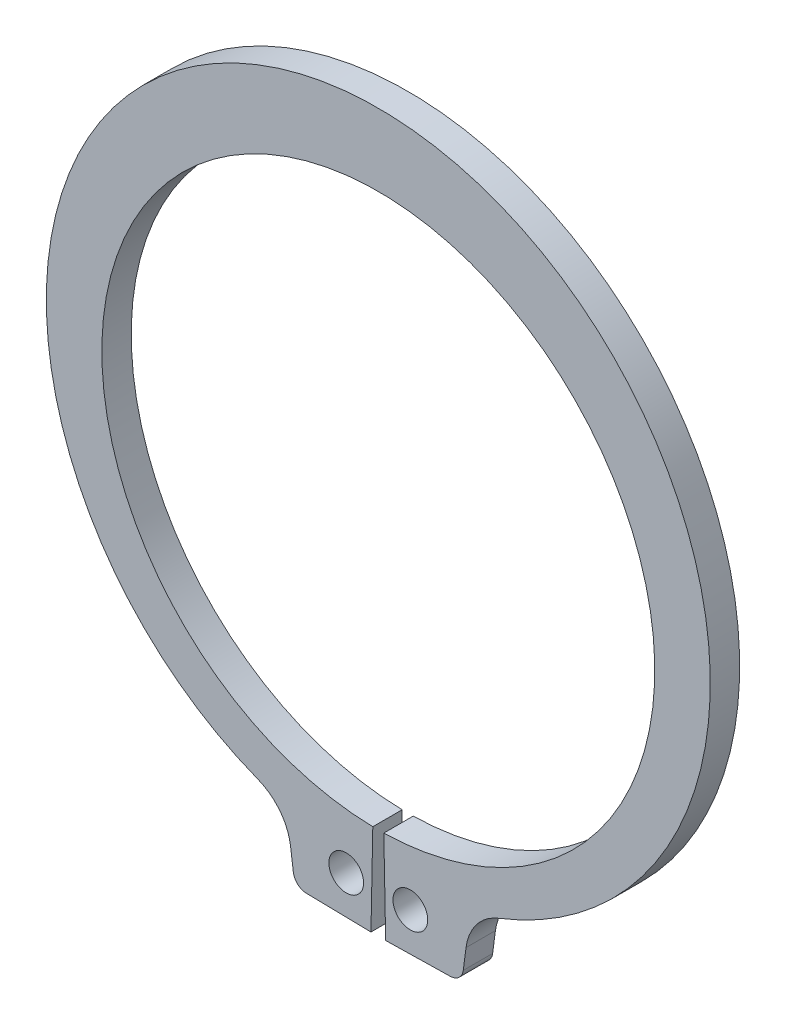
ISO-10303-21;
HEADER;
FILE_DESCRIPTION(('STEP AP214'),'2;1');
FILE_NAME('part.step','',(''),(''),'','','');
FILE_SCHEMA(('AUTOMOTIVE_DESIGN { 1 0 10303 214 1 1 1 1 }'));
ENDSEC;
DATA;
#1=APPLICATION_CONTEXT('core data for automotive mechanical design processes');
#2=APPLICATION_PROTOCOL_DEFINITION('international standard','automotive_design',2000,#1);
#3=PRODUCT_CONTEXT('',#1,'mechanical');
#4=PRODUCT('Part','Part','',(#3));
#5=PRODUCT_RELATED_PRODUCT_CATEGORY('part','',(#4));
#6=PRODUCT_DEFINITION_FORMATION('','',#4);
#7=PRODUCT_DEFINITION_CONTEXT('part definition',#1,'design');
#8=PRODUCT_DEFINITION('design','',#6,#7);
#9=PRODUCT_DEFINITION_SHAPE('','',#8);
#10=(LENGTH_UNIT() NAMED_UNIT(*) SI_UNIT(.MILLI.,.METRE.));
#11=(NAMED_UNIT(*) PLANE_ANGLE_UNIT() SI_UNIT($,.RADIAN.));
#12=(NAMED_UNIT(*) SI_UNIT($,.STERADIAN.) SOLID_ANGLE_UNIT());
#13=UNCERTAINTY_MEASURE_WITH_UNIT(LENGTH_MEASURE(1.E-05),#10,'distance_accuracy_value','');
#14=(GEOMETRIC_REPRESENTATION_CONTEXT(3) GLOBAL_UNCERTAINTY_ASSIGNED_CONTEXT((#13)) GLOBAL_UNIT_ASSIGNED_CONTEXT((#10,
#11,#12)) REPRESENTATION_CONTEXT('',''));
#15=CARTESIAN_POINT('',(0.,0.,0.));
#16=DIRECTION('',(0.,0.,1.));
#17=DIRECTION('',(1.,0.,0.));
#18=AXIS2_PLACEMENT_3D('',#15,#16,#17);
#19=CARTESIAN_POINT('',(-7.14059704762349,-2.71795638710457,5.42021469428682));
#20=DIRECTION('',(0.,0.,1.));
#21=DIRECTION('',(1.,0.,0.));
#22=AXIS2_PLACEMENT_3D('',#19,#20,#21);
#23=CYLINDRICAL_SURFACE('',#22,10.35);
#24=CARTESIAN_POINT('',(-7.14059704762349,-2.71795638710457,6.52021469428682));
#25=DIRECTION('',(0.,0.,-1.));
#26=DIRECTION('',(1.,0.,0.));
#27=AXIS2_PLACEMENT_3D('',#24,#25,#26);
#28=CIRCLE('',#27,10.35);
#29=CARTESIAN_POINT('',(-7.34684704762349,-13.0659011558739,6.52021469428682));
#30=VERTEX_POINT('',#29);
#31=CARTESIAN_POINT('',(-6.93434704762349,-13.0659011558739,6.52021469428682));
#32=VERTEX_POINT('',#31);
#33=EDGE_CURVE('E137',#30,#32,#28,.T.);
#34=ORIENTED_EDGE('',*,*,#33,.F.);
#35=DIRECTION('',(0.,0.,1.));
#36=VECTOR('',#35,1.);
#37=CARTESIAN_POINT('',(-7.34684704762349,-13.0659011558739,5.42021469428682));
#38=LINE('',#37,#36);
#39=CARTESIAN_POINT('',(-7.34684704762349,-13.0659011558739,5.42021469428682));
#40=VERTEX_POINT('',#39);
#41=EDGE_CURVE('E10',#40,#30,#38,.T.);
#42=ORIENTED_EDGE('',*,*,#41,.F.);
#43=CARTESIAN_POINT('',(-7.14059704762349,-2.71795638710457,5.42021469428682));
#44=DIRECTION('',(0.,0.,-1.));
#45=DIRECTION('',(1.,0.,0.));
#46=AXIS2_PLACEMENT_3D('',#43,#44,#45);
#47=CIRCLE('',#46,10.35);
#48=CARTESIAN_POINT('',(-6.93434704762349,-13.0659011558739,5.42021469428682));
#49=VERTEX_POINT('',#48);
#50=EDGE_CURVE('E170',#40,#49,#47,.T.);
#51=ORIENTED_EDGE('',*,*,#50,.T.);
#52=DIRECTION('',(0.,0.,1.));
#53=VECTOR('',#52,1.);
#54=CARTESIAN_POINT('',(-6.93434704762349,-13.0659011558739,5.42021469428682));
#55=LINE('',#54,#53);
#56=EDGE_CURVE('E19',#49,#32,#55,.T.);
#57=ORIENTED_EDGE('',*,*,#56,.T.);
#58=EDGE_LOOP('',(#34,#42,#51,#57));
#59=FACE_BOUND('',#58,.T.);
#60=ADVANCED_FACE('F16',(#59),#23,.F.);
#61=CARTESIAN_POINT('',(-7.34684704762349,-13.0659011558739,5.42021469428682));
#62=DIRECTION('',(0.999801426934232,-0.0199275362318841,0.));
#63=DIRECTION('',(0.0199275362318841,0.999801426934232,0.));
#64=AXIS2_PLACEMENT_3D('',#61,#62,#63);
#65=PLANE('',#64);
#66=DIRECTION('',(0.0199275362318841,0.999801426934232,0.));
#67=VECTOR('',#66,1.);
#68=CARTESIAN_POINT('',(-7.34684704762349,-13.0659011558739,6.52021469428682));
#69=LINE('',#68,#67);
#70=CARTESIAN_POINT('',(-7.41559704762349,-16.515216078797,6.52021469428682));
#71=VERTEX_POINT('',#70);
#72=EDGE_CURVE('E168',#71,#30,#69,.T.);
#73=ORIENTED_EDGE('',*,*,#72,.F.);
#74=DIRECTION('',(0.,0.,1.));
#75=VECTOR('',#74,1.);
#76=CARTESIAN_POINT('',(-7.41559704762349,-16.515216078797,5.42021469428682));
#77=LINE('',#76,#75);
#78=CARTESIAN_POINT('',(-7.41559704762349,-16.515216078797,5.42021469428682));
#79=VERTEX_POINT('',#78);
#80=EDGE_CURVE('E25',#79,#71,#77,.T.);
#81=ORIENTED_EDGE('',*,*,#80,.F.);
#82=DIRECTION('',(0.0199275362318841,0.999801426934232,0.));
#83=VECTOR('',#82,1.);
#84=CARTESIAN_POINT('',(-7.34684704762349,-13.0659011558739,5.42021469428682));
#85=LINE('',#84,#83);
#86=EDGE_CURVE('E127',#79,#40,#85,.T.);
#87=ORIENTED_EDGE('',*,*,#86,.T.);
#88=ORIENTED_EDGE('',*,*,#41,.T.);
#89=EDGE_LOOP('',(#73,#81,#87,#88));
#90=FACE_BOUND('',#89,.T.);
#91=ADVANCED_FACE('F190',(#90),#65,.T.);
#92=CARTESIAN_POINT('',(-7.41559704762349,-16.515216078797,5.42021469428682));
#93=DIRECTION('',(-0.019927536231884,-0.999801426934232,0.));
#94=DIRECTION('',(0.999801426934232,-0.019927536231884,0.));
#95=AXIS2_PLACEMENT_3D('',#92,#93,#94);
#96=PLANE('',#95);
#97=DIRECTION('',(0.999801426934232,-0.019927536231884,0.));
#98=VECTOR('',#97,1.);
#99=CARTESIAN_POINT('',(-7.41559704762349,-16.515216078797,6.52021469428682));
#100=LINE('',#99,#98);
#101=CARTESIAN_POINT('',(-9.8346765424431,-16.4670002101433,6.52021469428682));
#102=VERTEX_POINT('',#101);
#103=EDGE_CURVE('E114',#102,#71,#100,.T.);
#104=ORIENTED_EDGE('',*,*,#103,.F.);
#105=DIRECTION('',(0.,0.,1.));
#106=VECTOR('',#105,1.);
#107=CARTESIAN_POINT('',(-9.8346765424431,-16.4670002101433,5.42021469428682));
#108=LINE('',#107,#106);
#109=CARTESIAN_POINT('',(-9.8346765424431,-16.4670002101433,5.42021469428682));
#110=VERTEX_POINT('',#109);
#111=EDGE_CURVE('E109',#110,#102,#108,.T.);
#112=ORIENTED_EDGE('',*,*,#111,.F.);
#113=DIRECTION('',(0.999801426934232,-0.019927536231884,0.));
#114=VECTOR('',#113,1.);
#115=CARTESIAN_POINT('',(-7.41559704762349,-16.515216078797,5.42021469428682));
#116=LINE('',#115,#114);
#117=EDGE_CURVE('E112',#110,#79,#116,.T.);
#118=ORIENTED_EDGE('',*,*,#117,.T.);
#119=ORIENTED_EDGE('',*,*,#80,.T.);
#120=EDGE_LOOP('',(#104,#112,#118,#119));
#121=FACE_BOUND('',#120,.T.);
#122=ADVANCED_FACE('F111',(#121),#96,.T.);
#123=CARTESIAN_POINT('',(-9.82471277432716,-15.9670994966762,5.42021469428682));
#124=DIRECTION('',(0.,0.,1.));
#125=DIRECTION('',(1.,0.,0.));
#126=AXIS2_PLACEMENT_3D('',#123,#124,#125);
#127=CYLINDRICAL_SURFACE('',#126,0.500000000000001);
#128=CARTESIAN_POINT('',(-9.82471277432716,-15.9670994966762,6.52021469428682));
#129=DIRECTION('',(0.,0.,1.));
#130=DIRECTION('',(1.,0.,0.));
#131=AXIS2_PLACEMENT_3D('',#128,#129,#130);
#132=CIRCLE('',#131,0.500000000000001);
#133=CARTESIAN_POINT('',(-10.3204352050141,-16.0323625927862,6.52021469428682));
#134=VERTEX_POINT('',#133);
#135=EDGE_CURVE('E165',#134,#102,#132,.T.);
#136=ORIENTED_EDGE('',*,*,#135,.F.);
#137=DIRECTION('',(0.,0.,1.));
#138=VECTOR('',#137,1.);
#139=CARTESIAN_POINT('',(-10.3204352050141,-16.0323625927862,5.42021469428682));
#140=LINE('',#139,#138);
#141=CARTESIAN_POINT('',(-10.3204352050141,-16.0323625927862,5.42021469428682));
#142=VERTEX_POINT('',#141);
#143=EDGE_CURVE('E119',#142,#134,#140,.T.);
#144=ORIENTED_EDGE('',*,*,#143,.F.);
#145=CARTESIAN_POINT('',(-9.82471277432716,-15.9670994966762,5.42021469428682));
#146=DIRECTION('',(0.,0.,1.));
#147=DIRECTION('',(1.,0.,0.));
#148=AXIS2_PLACEMENT_3D('',#145,#146,#147);
#149=CIRCLE('',#148,0.500000000000001);
#150=EDGE_CURVE('E125',#142,#110,#149,.T.);
#151=ORIENTED_EDGE('',*,*,#150,.T.);
#152=ORIENTED_EDGE('',*,*,#111,.T.);
#153=EDGE_LOOP('',(#136,#144,#151,#152));
#154=FACE_BOUND('',#153,.T.);
#155=ADVANCED_FACE('F129',(#154),#127,.T.);
#156=CARTESIAN_POINT('',(-10.4248531097688,-15.239229863303,5.42021469428682));
#157=DIRECTION('',(-0.991444861373811,-0.13052619222005,0.));
#158=DIRECTION('',(0.13052619222005,-0.991444861373811,0.));
#159=AXIS2_PLACEMENT_3D('',#156,#157,#158);
#160=PLANE('',#159);
#161=DIRECTION('',(0.13052619222005,-0.991444861373811,0.));
#162=VECTOR('',#161,1.);
#163=CARTESIAN_POINT('',(-10.4248531097688,-15.239229863303,6.52021469428682));
#164=LINE('',#163,#162);
#165=CARTESIAN_POINT('',(-10.4248531097688,-15.239229863303,6.52021469428682));
#166=VERTEX_POINT('',#165);
#167=EDGE_CURVE('E162',#166,#134,#164,.T.);
#168=ORIENTED_EDGE('',*,*,#167,.F.);
#169=DIRECTION('',(0.,0.,1.));
#170=VECTOR('',#169,1.);
#171=CARTESIAN_POINT('',(-10.4248531097688,-15.239229863303,5.42021469428682));
#172=LINE('',#171,#170);
#173=CARTESIAN_POINT('',(-10.4248531097688,-15.239229863303,5.42021469428682));
#174=VERTEX_POINT('',#173);
#175=EDGE_CURVE('E174',#174,#166,#172,.T.);
#176=ORIENTED_EDGE('',*,*,#175,.F.);
#177=DIRECTION('',(0.13052619222005,-0.991444861373811,0.));
#178=VECTOR('',#177,1.);
#179=CARTESIAN_POINT('',(-10.4248531097688,-15.239229863303,5.42021469428682));
#180=LINE('',#179,#178);
#181=EDGE_CURVE('E130',#174,#142,#180,.T.);
#182=ORIENTED_EDGE('',*,*,#181,.T.);
#183=ORIENTED_EDGE('',*,*,#143,.T.);
#184=EDGE_LOOP('',(#168,#176,#182,#183));
#185=FACE_BOUND('',#184,.T.);
#186=ADVANCED_FACE('F204',(#185),#160,.T.);
#187=CARTESIAN_POINT('',(-12.3578714445961,-15.4937165549652,5.42021469428682));
#188=DIRECTION('',(0.,0.,1.));
#189=DIRECTION('',(1.,0.,0.));
#190=AXIS2_PLACEMENT_3D('',#187,#188,#189);
#191=CYLINDRICAL_SURFACE('',#190,1.94969827383917);
#192=CARTESIAN_POINT('',(-12.3578714445961,-15.4937165549652,6.52021469428682));
#193=DIRECTION('',(0.,0.,-1.));
#194=DIRECTION('',(1.,0.,0.));
#195=AXIS2_PLACEMENT_3D('',#192,#193,#194);
#196=CIRCLE('',#195,1.94969827383917);
#197=CARTESIAN_POINT('',(-11.6503806654026,-13.6769116242234,6.52021469428682));
#198=VERTEX_POINT('',#197);
#199=EDGE_CURVE('E159',#198,#166,#196,.T.);
#200=ORIENTED_EDGE('',*,*,#199,.F.);
#201=DIRECTION('',(0.,0.,1.));
#202=VECTOR('',#201,1.);
#203=CARTESIAN_POINT('',(-11.6503806654026,-13.6769116242234,5.42021469428682));
#204=LINE('',#203,#202);
#205=CARTESIAN_POINT('',(-11.6503806654026,-13.6769116242234,5.42021469428682));
#206=VERTEX_POINT('',#205);
#207=EDGE_CURVE('E176',#206,#198,#204,.T.);
#208=ORIENTED_EDGE('',*,*,#207,.F.);
#209=CARTESIAN_POINT('',(-12.3578714445961,-15.4937165549652,5.42021469428682));
#210=DIRECTION('',(0.,0.,-1.));
#211=DIRECTION('',(1.,0.,0.));
#212=AXIS2_PLACEMENT_3D('',#209,#210,#211);
#213=CIRCLE('',#212,1.94969827383917);
#214=EDGE_CURVE('E132',#206,#174,#213,.T.);
#215=ORIENTED_EDGE('',*,*,#214,.T.);
#216=ORIENTED_EDGE('',*,*,#175,.T.);
#217=EDGE_LOOP('',(#200,#208,#215,#216));
#218=FACE_BOUND('',#217,.T.);
#219=ADVANCED_FACE('F207',(#218),#191,.F.);
#220=CARTESIAN_POINT('',(-7.14059704762349,-2.09598738560752,5.42021469428682));
#221=DIRECTION('',(0.,0.,1.));
#222=DIRECTION('',(1.,0.,0.));
#223=AXIS2_PLACEMENT_3D('',#220,#221,#222);
#224=CYLINDRICAL_SURFACE('',#223,12.4280309985029);
#225=CARTESIAN_POINT('',(-7.14059704762349,-2.09598738560752,6.52021469428682));
#226=DIRECTION('',(0.,0.,1.));
#227=DIRECTION('',(1.,0.,0.));
#228=AXIS2_PLACEMENT_3D('',#225,#226,#227);
#229=CIRCLE('',#228,12.4280309985029);
#230=CARTESIAN_POINT('',(-2.63081342984442,-13.6769116242234,6.52021469428682));
#231=VERTEX_POINT('',#230);
#232=EDGE_CURVE('E156',#231,#198,#229,.T.);
#233=ORIENTED_EDGE('',*,*,#232,.F.);
#234=DIRECTION('',(0.,0.,1.));
#235=VECTOR('',#234,1.);
#236=CARTESIAN_POINT('',(-2.63081342984442,-13.6769116242234,5.42021469428682));
#237=LINE('',#236,#235);
#238=CARTESIAN_POINT('',(-2.63081342984442,-13.6769116242234,5.42021469428682));
#239=VERTEX_POINT('',#238);
#240=EDGE_CURVE('E178',#239,#231,#237,.T.);
#241=ORIENTED_EDGE('',*,*,#240,.F.);
#242=CARTESIAN_POINT('',(-7.14059704762349,-2.09598738560752,5.42021469428682));
#243=DIRECTION('',(0.,0.,1.));
#244=DIRECTION('',(1.,0.,0.));
#245=AXIS2_PLACEMENT_3D('',#242,#243,#244);
#246=CIRCLE('',#245,12.4280309985029);
#247=EDGE_CURVE('E281',#239,#206,#246,.T.);
#248=ORIENTED_EDGE('',*,*,#247,.T.);
#249=ORIENTED_EDGE('',*,*,#207,.T.);
#250=EDGE_LOOP('',(#233,#241,#248,#249));
#251=FACE_BOUND('',#250,.T.);
#252=ADVANCED_FACE('F211',(#251),#224,.T.);
#253=CARTESIAN_POINT('',(-1.9233226506509,-15.4937165549652,5.42021469428682));
#254=DIRECTION('',(0.,0.,1.));
#255=DIRECTION('',(1.,0.,0.));
#256=AXIS2_PLACEMENT_3D('',#253,#254,#255);
#257=CYLINDRICAL_SURFACE('',#256,1.94969827383917);
#258=CARTESIAN_POINT('',(-1.9233226506509,-15.4937165549652,6.52021469428682));
#259=DIRECTION('',(0.,0.,-1.));
#260=DIRECTION('',(1.,0.,0.));
#261=AXIS2_PLACEMENT_3D('',#258,#259,#260);
#262=CIRCLE('',#261,1.94969827383917);
#263=CARTESIAN_POINT('',(-3.85634098547814,-15.239229863303,6.52021469428682));
#264=VERTEX_POINT('',#263);
#265=EDGE_CURVE('E153',#264,#231,#262,.T.);
#266=ORIENTED_EDGE('',*,*,#265,.F.);
#267=DIRECTION('',(0.,0.,1.));
#268=VECTOR('',#267,1.);
#269=CARTESIAN_POINT('',(-3.85634098547814,-15.239229863303,5.42021469428682));
#270=LINE('',#269,#268);
#271=CARTESIAN_POINT('',(-3.85634098547814,-15.239229863303,5.42021469428682));
#272=VERTEX_POINT('',#271);
#273=EDGE_CURVE('E180',#272,#264,#270,.T.);
#274=ORIENTED_EDGE('',*,*,#273,.F.);
#275=CARTESIAN_POINT('',(-1.9233226506509,-15.4937165549652,5.42021469428682));
#276=DIRECTION('',(0.,0.,-1.));
#277=DIRECTION('',(1.,0.,0.));
#278=AXIS2_PLACEMENT_3D('',#275,#276,#277);
#279=CIRCLE('',#278,1.94969827383917);
#280=EDGE_CURVE('E278',#272,#239,#279,.T.);
#281=ORIENTED_EDGE('',*,*,#280,.T.);
#282=ORIENTED_EDGE('',*,*,#240,.T.);
#283=EDGE_LOOP('',(#266,#274,#281,#282));
#284=FACE_BOUND('',#283,.T.);
#285=ADVANCED_FACE('F215',(#284),#257,.F.);
#286=CARTESIAN_POINT('',(-3.85634098547814,-15.239229863303,5.42021469428682));
#287=DIRECTION('',(0.991444861373811,-0.13052619222005,0.));
#288=DIRECTION('',(0.13052619222005,0.991444861373811,0.));
#289=AXIS2_PLACEMENT_3D('',#286,#287,#288);
#290=PLANE('',#289);
#291=DIRECTION('',(0.13052619222005,0.991444861373811,0.));
#292=VECTOR('',#291,1.);
#293=CARTESIAN_POINT('',(-3.85634098547814,-15.239229863303,6.52021469428682));
#294=LINE('',#293,#292);
#295=CARTESIAN_POINT('',(-3.96075889023291,-16.0323625927862,6.52021469428682));
#296=VERTEX_POINT('',#295);
#297=EDGE_CURVE('E150',#296,#264,#294,.T.);
#298=ORIENTED_EDGE('',*,*,#297,.F.);
#299=DIRECTION('',(0.,0.,1.));
#300=VECTOR('',#299,1.);
#301=CARTESIAN_POINT('',(-3.96075889023291,-16.0323625927862,5.42021469428682));
#302=LINE('',#301,#300);
#303=CARTESIAN_POINT('',(-3.96075889023291,-16.0323625927862,5.42021469428682));
#304=VERTEX_POINT('',#303);
#305=EDGE_CURVE('E182',#304,#296,#302,.T.);
#306=ORIENTED_EDGE('',*,*,#305,.F.);
#307=DIRECTION('',(0.13052619222005,0.991444861373811,0.));
#308=VECTOR('',#307,1.);
#309=CARTESIAN_POINT('',(-3.85634098547814,-15.239229863303,5.42021469428682));
#310=LINE('',#309,#308);
#311=EDGE_CURVE('E275',#304,#272,#310,.T.);
#312=ORIENTED_EDGE('',*,*,#311,.T.);
#313=ORIENTED_EDGE('',*,*,#273,.T.);
#314=EDGE_LOOP('',(#298,#306,#312,#313));
#315=FACE_BOUND('',#314,.T.);
#316=ADVANCED_FACE('F219',(#315),#290,.T.);
#317=CARTESIAN_POINT('',(-4.45648132091982,-15.9670994966762,5.42021469428682));
#318=DIRECTION('',(0.,0.,1.));
#319=DIRECTION('',(1.,0.,0.));
#320=AXIS2_PLACEMENT_3D('',#317,#318,#319);
#321=CYLINDRICAL_SURFACE('',#320,0.500000000000001);
#322=CARTESIAN_POINT('',(-4.45648132091982,-15.9670994966762,6.52021469428682));
#323=DIRECTION('',(0.,0.,1.));
#324=DIRECTION('',(-1.,0.,0.));
#325=AXIS2_PLACEMENT_3D('',#322,#323,#324);
#326=CIRCLE('',#325,0.500000000000001);
#327=CARTESIAN_POINT('',(-4.44651755280388,-16.4670002101433,6.52021469428682));
#328=VERTEX_POINT('',#327);
#329=EDGE_CURVE('E147',#328,#296,#326,.T.);
#330=ORIENTED_EDGE('',*,*,#329,.F.);
#331=DIRECTION('',(0.,0.,1.));
#332=VECTOR('',#331,1.);
#333=CARTESIAN_POINT('',(-4.44651755280388,-16.4670002101433,5.42021469428682));
#334=LINE('',#333,#332);
#335=CARTESIAN_POINT('',(-4.44651755280388,-16.4670002101433,5.42021469428682));
#336=VERTEX_POINT('',#335);
#337=EDGE_CURVE('E184',#336,#328,#334,.T.);
#338=ORIENTED_EDGE('',*,*,#337,.F.);
#339=CARTESIAN_POINT('',(-4.45648132091982,-15.9670994966762,5.42021469428682));
#340=DIRECTION('',(0.,0.,1.));
#341=DIRECTION('',(-1.,0.,0.));
#342=AXIS2_PLACEMENT_3D('',#339,#340,#341);
#343=CIRCLE('',#342,0.500000000000001);
#344=EDGE_CURVE('E272',#336,#304,#343,.T.);
#345=ORIENTED_EDGE('',*,*,#344,.T.);
#346=ORIENTED_EDGE('',*,*,#305,.T.);
#347=EDGE_LOOP('',(#330,#338,#345,#346));
#348=FACE_BOUND('',#347,.T.);
#349=ADVANCED_FACE('F223',(#348),#321,.T.);
#350=CARTESIAN_POINT('',(-6.86559704762349,-16.515216078797,5.42021469428682));
#351=DIRECTION('',(0.019927536231884,-0.999801426934232,0.));
#352=DIRECTION('',(0.999801426934232,0.019927536231884,0.));
#353=AXIS2_PLACEMENT_3D('',#350,#351,#352);
#354=PLANE('',#353);
#355=DIRECTION('',(0.999801426934232,0.019927536231884,0.));
#356=VECTOR('',#355,1.);
#357=CARTESIAN_POINT('',(-6.86559704762349,-16.515216078797,6.52021469428682));
#358=LINE('',#357,#356);
#359=CARTESIAN_POINT('',(-6.86559704762349,-16.515216078797,6.52021469428682));
#360=VERTEX_POINT('',#359);
#361=EDGE_CURVE('E144',#360,#328,#358,.T.);
#362=ORIENTED_EDGE('',*,*,#361,.F.);
#363=DIRECTION('',(0.,0.,1.));
#364=VECTOR('',#363,1.);
#365=CARTESIAN_POINT('',(-6.86559704762349,-16.515216078797,5.42021469428682));
#366=LINE('',#365,#364);
#367=CARTESIAN_POINT('',(-6.86559704762349,-16.515216078797,5.42021469428682));
#368=VERTEX_POINT('',#367);
#369=EDGE_CURVE('E185',#368,#360,#366,.T.);
#370=ORIENTED_EDGE('',*,*,#369,.F.);
#371=DIRECTION('',(0.999801426934232,0.019927536231884,0.));
#372=VECTOR('',#371,1.);
#373=CARTESIAN_POINT('',(-6.86559704762349,-16.515216078797,5.42021469428682));
#374=LINE('',#373,#372);
#375=EDGE_CURVE('E269',#368,#336,#374,.T.);
#376=ORIENTED_EDGE('',*,*,#375,.T.);
#377=ORIENTED_EDGE('',*,*,#337,.T.);
#378=EDGE_LOOP('',(#362,#370,#376,#377));
#379=FACE_BOUND('',#378,.T.);
#380=ADVANCED_FACE('F227',(#379),#354,.T.);
#381=CARTESIAN_POINT('',(-6.93434704762349,-13.0659011558739,5.42021469428682));
#382=DIRECTION('',(-0.999801426934232,-0.0199275362318841,0.));
#383=DIRECTION('',(0.0199275362318841,-0.999801426934232,0.));
#384=AXIS2_PLACEMENT_3D('',#381,#382,#383);
#385=PLANE('',#384);
#386=DIRECTION('',(0.0199275362318841,-0.999801426934232,0.));
#387=VECTOR('',#386,1.);
#388=CARTESIAN_POINT('',(-6.93434704762349,-13.0659011558739,6.52021469428682));
#389=LINE('',#388,#387);
#390=EDGE_CURVE('E140',#32,#360,#389,.T.);
#391=ORIENTED_EDGE('',*,*,#390,.F.);
#392=ORIENTED_EDGE('',*,*,#56,.F.);
#393=DIRECTION('',(0.0199275362318841,-0.999801426934232,0.));
#394=VECTOR('',#393,1.);
#395=CARTESIAN_POINT('',(-6.93434704762349,-13.0659011558739,5.42021469428682));
#396=LINE('',#395,#394);
#397=EDGE_CURVE('E267',#49,#368,#396,.T.);
#398=ORIENTED_EDGE('',*,*,#397,.T.);
#399=ORIENTED_EDGE('',*,*,#369,.T.);
#400=EDGE_LOOP('',(#391,#392,#398,#399));
#401=FACE_BOUND('',#400,.T.);
#402=ADVANCED_FACE('F187',(#401),#385,.T.);
#403=CARTESIAN_POINT('',(-7.14059704762349,-2.71795638710457,5.42021469428682));
#404=DIRECTION('',(0.,0.,1.));
#405=DIRECTION('',(1.,0.,0.));
#406=AXIS2_PLACEMENT_3D('',#403,#404,#405);
#407=PLANE('',#406);
#408=CARTESIAN_POINT('',(-8.34059704762349,-15.0597552835378,5.42021469428682));
#409=DIRECTION('',(0.,0.,1.));
#410=DIRECTION('',(1.,0.,0.));
#411=AXIS2_PLACEMENT_3D('',#408,#409,#410);
#412=CIRCLE('',#411,0.65);
#413=CARTESIAN_POINT('',(-7.69059704762349,-15.0597552835378,5.42021469428682));
#414=VERTEX_POINT('',#413);
#415=EDGE_CURVE('E254',#414,#414,#412,.T.);
#416=ORIENTED_EDGE('',*,*,#415,.T.);
#417=EDGE_LOOP('',(#416));
#418=FACE_BOUND('',#417,.T.);
#419=CARTESIAN_POINT('',(-5.94059704762349,-15.0597552835378,5.42021469428682));
#420=DIRECTION('',(0.,0.,1.));
#421=DIRECTION('',(1.,0.,0.));
#422=AXIS2_PLACEMENT_3D('',#419,#420,#421);
#423=CIRCLE('',#422,0.65);
#424=CARTESIAN_POINT('',(-5.29059704762349,-15.0597552835378,5.42021469428682));
#425=VERTEX_POINT('',#424);
#426=EDGE_CURVE('E141',#425,#425,#423,.T.);
#427=ORIENTED_EDGE('',*,*,#426,.T.);
#428=EDGE_LOOP('',(#427));
#429=FACE_BOUND('',#428,.T.);
#430=ORIENTED_EDGE('',*,*,#50,.F.);
#431=ORIENTED_EDGE('',*,*,#86,.F.);
#432=ORIENTED_EDGE('',*,*,#117,.F.);
#433=ORIENTED_EDGE('',*,*,#150,.F.);
#434=ORIENTED_EDGE('',*,*,#181,.F.);
#435=ORIENTED_EDGE('',*,*,#214,.F.);
#436=ORIENTED_EDGE('',*,*,#247,.F.);
#437=ORIENTED_EDGE('',*,*,#280,.F.);
#438=ORIENTED_EDGE('',*,*,#311,.F.);
#439=ORIENTED_EDGE('',*,*,#344,.F.);
#440=ORIENTED_EDGE('',*,*,#375,.F.);
#441=ORIENTED_EDGE('',*,*,#397,.F.);
#442=EDGE_LOOP('',(#430,#431,#432,#433,#434,#435,#436,#437,#438,#439,#440,#441));
#443=FACE_BOUND('',#442,.T.);
#444=ADVANCED_FACE('F123',(#418,#429,#443),#407,.F.);
#445=CARTESIAN_POINT('',(-7.14059704762349,-2.71795638710457,6.52021469428682));
#446=DIRECTION('',(0.,0.,1.));
#447=DIRECTION('',(1.,0.,0.));
#448=AXIS2_PLACEMENT_3D('',#445,#446,#447);
#449=PLANE('',#448);
#450=CARTESIAN_POINT('',(-8.34059704762349,-15.0597552835378,6.52021469428682));
#451=DIRECTION('',(0.,0.,1.));
#452=DIRECTION('',(1.,0.,0.));
#453=AXIS2_PLACEMENT_3D('',#450,#451,#452);
#454=CIRCLE('',#453,0.65);
#455=CARTESIAN_POINT('',(-7.69059704762349,-15.0597552835378,6.52021469428682));
#456=VERTEX_POINT('',#455);
#457=EDGE_CURVE('E257',#456,#456,#454,.T.);
#458=ORIENTED_EDGE('',*,*,#457,.F.);
#459=EDGE_LOOP('',(#458));
#460=FACE_BOUND('',#459,.T.);
#461=CARTESIAN_POINT('',(-5.94059704762349,-15.0597552835378,6.52021469428682));
#462=DIRECTION('',(0.,0.,1.));
#463=DIRECTION('',(1.,0.,0.));
#464=AXIS2_PLACEMENT_3D('',#461,#462,#463);
#465=CIRCLE('',#464,0.65);
#466=CARTESIAN_POINT('',(-5.29059704762349,-15.0597552835378,6.52021469428682));
#467=VERTEX_POINT('',#466);
#468=EDGE_CURVE('E259',#467,#467,#465,.T.);
#469=ORIENTED_EDGE('',*,*,#468,.F.);
#470=EDGE_LOOP('',(#469));
#471=FACE_BOUND('',#470,.T.);
#472=ORIENTED_EDGE('',*,*,#33,.T.);
#473=ORIENTED_EDGE('',*,*,#390,.T.);
#474=ORIENTED_EDGE('',*,*,#361,.T.);
#475=ORIENTED_EDGE('',*,*,#329,.T.);
#476=ORIENTED_EDGE('',*,*,#297,.T.);
#477=ORIENTED_EDGE('',*,*,#265,.T.);
#478=ORIENTED_EDGE('',*,*,#232,.T.);
#479=ORIENTED_EDGE('',*,*,#199,.T.);
#480=ORIENTED_EDGE('',*,*,#167,.T.);
#481=ORIENTED_EDGE('',*,*,#135,.T.);
#482=ORIENTED_EDGE('',*,*,#103,.T.);
#483=ORIENTED_EDGE('',*,*,#72,.T.);
#484=EDGE_LOOP('',(#472,#473,#474,#475,#476,#477,#478,#479,#480,#481,#482,#483));
#485=FACE_BOUND('',#484,.T.);
#486=ADVANCED_FACE('F189',(#460,#471,#485),#449,.T.);
#487=CARTESIAN_POINT('',(-5.94059704762349,-15.0597552835378,5.42021469428682));
#488=DIRECTION('',(0.,0.,1.));
#489=DIRECTION('',(1.,0.,0.));
#490=AXIS2_PLACEMENT_3D('',#487,#488,#489);
#491=CYLINDRICAL_SURFACE('',#490,0.65);
#492=ORIENTED_EDGE('',*,*,#426,.F.);
#493=EDGE_LOOP('',(#492));
#494=FACE_BOUND('',#493,.T.);
#495=ORIENTED_EDGE('',*,*,#468,.T.);
#496=EDGE_LOOP('',(#495));
#497=FACE_BOUND('',#496,.T.);
#498=ADVANCED_FACE('F239',(#494,#497),#491,.F.);
#499=CARTESIAN_POINT('',(-8.34059704762349,-15.0597552835378,5.42021469428682));
#500=DIRECTION('',(0.,0.,1.));
#501=DIRECTION('',(1.,0.,0.));
#502=AXIS2_PLACEMENT_3D('',#499,#500,#501);
#503=CYLINDRICAL_SURFACE('',#502,0.65);
#504=ORIENTED_EDGE('',*,*,#415,.F.);
#505=EDGE_LOOP('',(#504));
#506=FACE_BOUND('',#505,.T.);
#507=ORIENTED_EDGE('',*,*,#457,.T.);
#508=EDGE_LOOP('',(#507));
#509=FACE_BOUND('',#508,.T.);
#510=ADVANCED_FACE('F246',(#506,#509),#503,.F.);
#511=CLOSED_SHELL('',(#60,#91,#122,#155,#186,#219,#252,#285,#316,#349,#380,#402,#444,#486,#498,#510));
#512=MANIFOLD_SOLID_BREP('B1',#511);
#513=ADVANCED_BREP_SHAPE_REPRESENTATION('',(#18,#512),#14);
#514=SHAPE_DEFINITION_REPRESENTATION(#9,#513);
ENDSEC;
END-ISO-10303-21;
